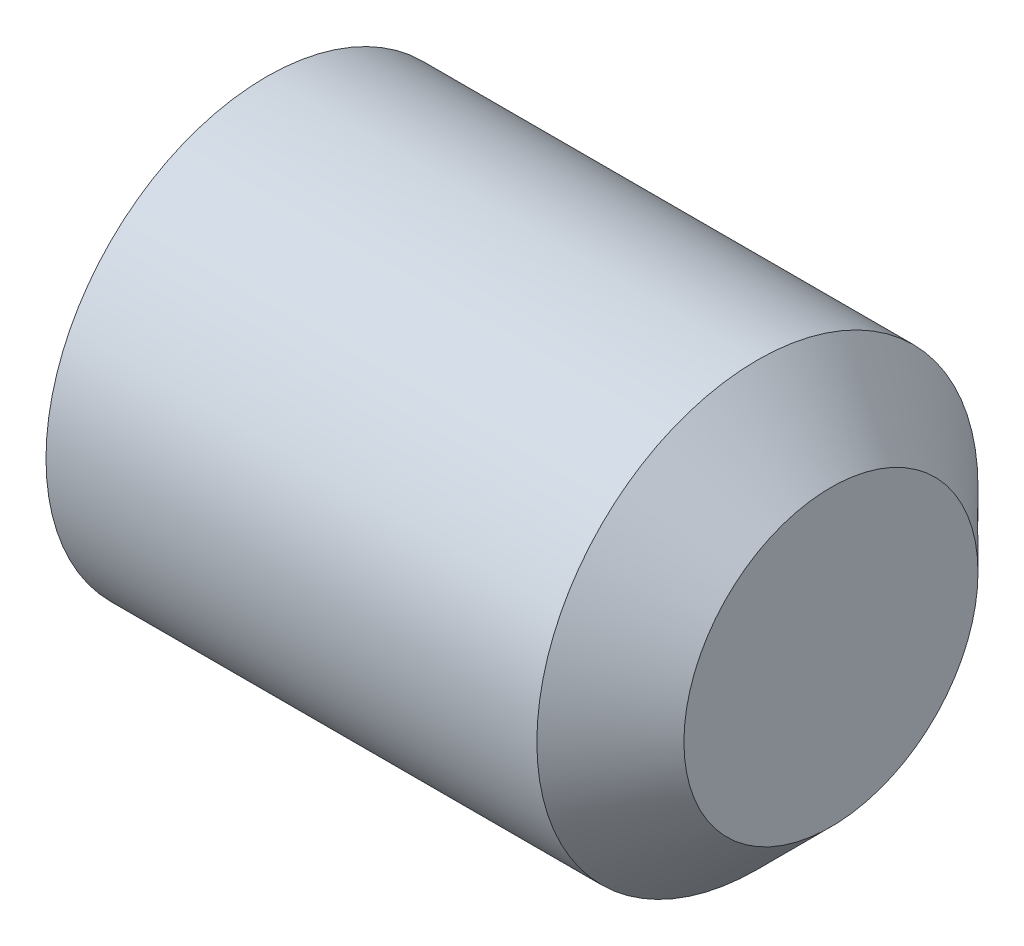
ISO-10303-21;
HEADER;
FILE_DESCRIPTION(('STEP AP214'),'2;1');
FILE_NAME('part.step','',(''),(''),'','','');
FILE_SCHEMA(('AUTOMOTIVE_DESIGN { 1 0 10303 214 1 1 1 1 }'));
ENDSEC;
DATA;
#1=APPLICATION_CONTEXT('core data for automotive mechanical design processes');
#2=APPLICATION_PROTOCOL_DEFINITION('international standard','automotive_design',2000,#1);
#3=PRODUCT_CONTEXT('',#1,'mechanical');
#4=PRODUCT('Part','Part','',(#3));
#5=PRODUCT_RELATED_PRODUCT_CATEGORY('part','',(#4));
#6=PRODUCT_DEFINITION_FORMATION('','',#4);
#7=PRODUCT_DEFINITION_CONTEXT('part definition',#1,'design');
#8=PRODUCT_DEFINITION('design','',#6,#7);
#9=PRODUCT_DEFINITION_SHAPE('','',#8);
#10=(LENGTH_UNIT() NAMED_UNIT(*) SI_UNIT(.MILLI.,.METRE.));
#11=(NAMED_UNIT(*) PLANE_ANGLE_UNIT() SI_UNIT($,.RADIAN.));
#12=(NAMED_UNIT(*) SI_UNIT($,.STERADIAN.) SOLID_ANGLE_UNIT());
#13=UNCERTAINTY_MEASURE_WITH_UNIT(LENGTH_MEASURE(1.E-05),#10,'distance_accuracy_value','');
#14=(GEOMETRIC_REPRESENTATION_CONTEXT(3) GLOBAL_UNCERTAINTY_ASSIGNED_CONTEXT((#13)) GLOBAL_UNIT_ASSIGNED_CONTEXT((#10,
#11,#12)) REPRESENTATION_CONTEXT('',''));
#15=CARTESIAN_POINT('',(0.,0.,0.));
#16=DIRECTION('',(0.,0.,1.));
#17=DIRECTION('',(1.,0.,0.));
#18=AXIS2_PLACEMENT_3D('',#15,#16,#17);
#19=CARTESIAN_POINT('',(0.,0.,0.));
#20=DIRECTION('',(-1.,0.,0.));
#21=DIRECTION('',(0.,0.,1.));
#22=AXIS2_PLACEMENT_3D('',#19,#20,#21);
#23=PLANE('',#22);
#24=CARTESIAN_POINT('',(0.,0.,0.));
#25=DIRECTION('',(-1.,0.,0.));
#26=DIRECTION('',(0.,0.,1.));
#27=AXIS2_PLACEMENT_3D('',#24,#25,#26);
#28=CIRCLE('',#27,1.2195);
#29=CARTESIAN_POINT('',(0.,0.,1.2195));
#30=VERTEX_POINT('',#29);
#31=EDGE_CURVE('E142',#30,#30,#28,.T.);
#32=ORIENTED_EDGE('',*,*,#31,.T.);
#33=EDGE_LOOP('',(#32));
#34=FACE_BOUND('',#33,.T.);
#35=DIRECTION('',(0.,0.,-1.));
#36=VECTOR('',#35,1.);
#37=CARTESIAN_POINT('',(0.,0.75,0.43301270189222));
#38=LINE('',#37,#36);
#39=CARTESIAN_POINT('',(0.,0.75,0.43301270189222));
#40=VERTEX_POINT('',#39);
#41=CARTESIAN_POINT('',(0.,0.75,-0.433012701892219));
#42=VERTEX_POINT('',#41);
#43=EDGE_CURVE('E133',#40,#42,#38,.T.);
#44=ORIENTED_EDGE('',*,*,#43,.F.);
#45=DIRECTION('',(0.,-0.866025403784438,0.5));
#46=VECTOR('',#45,1.);
#47=CARTESIAN_POINT('',(0.,0.75,0.43301270189222));
#48=LINE('',#47,#46);
#49=CARTESIAN_POINT('',(0.,0.,0.866025403784439));
#50=VERTEX_POINT('',#49);
#51=EDGE_CURVE('E55',#40,#50,#48,.T.);
#52=ORIENTED_EDGE('',*,*,#51,.T.);
#53=DIRECTION('',(0.,0.866025403784438,0.5));
#54=VECTOR('',#53,1.);
#55=CARTESIAN_POINT('',(0.,-0.750000000000001,0.43301270189222));
#56=LINE('',#55,#54);
#57=CARTESIAN_POINT('',(0.,-0.750000000000001,0.43301270189222));
#58=VERTEX_POINT('',#57);
#59=EDGE_CURVE('E124',#58,#50,#56,.T.);
#60=ORIENTED_EDGE('',*,*,#59,.F.);
#61=DIRECTION('',(0.,0.,-1.));
#62=VECTOR('',#61,1.);
#63=CARTESIAN_POINT('',(0.,-0.750000000000001,0.43301270189222));
#64=LINE('',#63,#62);
#65=CARTESIAN_POINT('',(0.,-0.750000000000001,-0.433012701892219));
#66=VERTEX_POINT('',#65);
#67=EDGE_CURVE('E127',#58,#66,#64,.T.);
#68=ORIENTED_EDGE('',*,*,#67,.T.);
#69=DIRECTION('',(0.,0.866025403784438,-0.500000000000001));
#70=VECTOR('',#69,1.);
#71=CARTESIAN_POINT('',(0.,-0.750000000000001,-0.433012701892219));
#72=LINE('',#71,#70);
#73=CARTESIAN_POINT('',(0.,0.,-0.866025403784439));
#74=VERTEX_POINT('',#73);
#75=EDGE_CURVE('E130',#66,#74,#72,.T.);
#76=ORIENTED_EDGE('',*,*,#75,.T.);
#77=DIRECTION('',(0.,-0.866025403784438,-0.500000000000001));
#78=VECTOR('',#77,1.);
#79=CARTESIAN_POINT('',(0.,0.75,-0.433012701892219));
#80=LINE('',#79,#78);
#81=EDGE_CURVE('E113',#42,#74,#80,.T.);
#82=ORIENTED_EDGE('',*,*,#81,.F.);
#83=EDGE_LOOP('',(#44,#52,#60,#68,#76,#82));
#84=FACE_BOUND('',#83,.T.);
#85=ADVANCED_FACE('F40',(#34,#84),#23,.T.);
#86=CARTESIAN_POINT('',(4.,1.,0.));
#87=DIRECTION('',(1.,0.,0.));
#88=DIRECTION('',(0.,0.,-1.));
#89=AXIS2_PLACEMENT_3D('',#86,#87,#88);
#90=PLANE('',#89);
#91=CARTESIAN_POINT('',(4.,0.,0.));
#92=DIRECTION('',(-1.,0.,0.));
#93=DIRECTION('',(0.,0.,1.));
#94=AXIS2_PLACEMENT_3D('',#91,#92,#93);
#95=CIRCLE('',#94,1.);
#96=CARTESIAN_POINT('',(4.,0.,1.));
#97=VERTEX_POINT('',#96);
#98=EDGE_CURVE('E11',#97,#97,#95,.T.);
#99=ORIENTED_EDGE('',*,*,#98,.F.);
#100=EDGE_LOOP('',(#99));
#101=FACE_BOUND('',#100,.T.);
#102=ADVANCED_FACE('F42',(#101),#90,.T.);
#103=CARTESIAN_POINT('',(3.5,0.,0.));
#104=DIRECTION('',(-1.,0.,0.));
#105=DIRECTION('',(0.,0.,1.));
#106=AXIS2_PLACEMENT_3D('',#103,#104,#105);
#107=CONICAL_SURFACE('',#106,1.5,0.785398163397447);
#108=ORIENTED_EDGE('',*,*,#98,.T.);
#109=EDGE_LOOP('',(#108));
#110=FACE_BOUND('',#109,.T.);
#111=CARTESIAN_POINT('',(3.5,0.,0.));
#112=DIRECTION('',(-1.,0.,0.));
#113=DIRECTION('',(0.,0.,1.));
#114=AXIS2_PLACEMENT_3D('',#111,#112,#113);
#115=CIRCLE('',#114,1.5);
#116=CARTESIAN_POINT('',(3.5,0.,1.5));
#117=VERTEX_POINT('',#116);
#118=EDGE_CURVE('E48',#117,#117,#115,.T.);
#119=ORIENTED_EDGE('',*,*,#118,.F.);
#120=EDGE_LOOP('',(#119));
#121=FACE_BOUND('',#120,.T.);
#122=ADVANCED_FACE('F153',(#110,#121),#107,.T.);
#123=CARTESIAN_POINT('',(-12.7,0.,0.));
#124=DIRECTION('',(-1.,0.,0.));
#125=DIRECTION('',(0.,0.,1.));
#126=AXIS2_PLACEMENT_3D('',#123,#124,#125);
#127=CYLINDRICAL_SURFACE('',#126,1.5);
#128=ORIENTED_EDGE('',*,*,#118,.T.);
#129=EDGE_LOOP('',(#128));
#130=FACE_BOUND('',#129,.T.);
#131=CARTESIAN_POINT('',(0.161946750507689,0.,0.));
#132=DIRECTION('',(-1.,0.,0.));
#133=DIRECTION('',(0.,0.,1.));
#134=AXIS2_PLACEMENT_3D('',#131,#132,#133);
#135=CIRCLE('',#134,1.5);
#136=CARTESIAN_POINT('',(0.161946750507689,0.,1.5));
#137=VERTEX_POINT('',#136);
#138=EDGE_CURVE('E145',#137,#137,#135,.T.);
#139=ORIENTED_EDGE('',*,*,#138,.F.);
#140=EDGE_LOOP('',(#139));
#141=FACE_BOUND('',#140,.T.);
#142=ADVANCED_FACE('F150',(#130,#141),#127,.T.);
#143=CARTESIAN_POINT('',(0.,0.,0.));
#144=DIRECTION('',(1.,0.,0.));
#145=DIRECTION('',(0.,0.,-1.));
#146=AXIS2_PLACEMENT_3D('',#143,#144,#145);
#147=CONICAL_SURFACE('',#146,1.2195,1.0471975511966);
#148=ORIENTED_EDGE('',*,*,#138,.T.);
#149=EDGE_LOOP('',(#148));
#150=FACE_BOUND('',#149,.T.);
#151=ORIENTED_EDGE('',*,*,#31,.F.);
#152=EDGE_LOOP('',(#151));
#153=FACE_BOUND('',#152,.T.);
#154=ADVANCED_FACE('F160',(#150,#153),#147,.T.);
#155=CARTESIAN_POINT('',(2.1,0.75,0.43301270189222));
#156=DIRECTION('',(0.,-0.5,-0.866025403784439));
#157=DIRECTION('',(0.,0.866025403784439,-0.5));
#158=AXIS2_PLACEMENT_3D('',#155,#156,#157);
#159=PLANE('',#158);
#160=ORIENTED_EDGE('',*,*,#51,.F.);
#161=DIRECTION('',(-1.,0.,0.));
#162=VECTOR('',#161,1.);
#163=CARTESIAN_POINT('',(2.1,0.75,0.43301270189222));
#164=LINE('',#163,#162);
#165=CARTESIAN_POINT('',(2.1,0.75,0.43301270189222));
#166=VERTEX_POINT('',#165);
#167=EDGE_CURVE('E60',#166,#40,#164,.T.);
#168=ORIENTED_EDGE('',*,*,#167,.F.);
#169=DIRECTION('',(0.,-0.866025403784438,0.5));
#170=VECTOR('',#169,1.);
#171=CARTESIAN_POINT('',(2.1,0.75,0.43301270189222));
#172=LINE('',#171,#170);
#173=CARTESIAN_POINT('',(2.1,0.,0.866025403784439));
#174=VERTEX_POINT('',#173);
#175=EDGE_CURVE('E87',#166,#174,#172,.T.);
#176=ORIENTED_EDGE('',*,*,#175,.T.);
#177=DIRECTION('',(-1.,0.,0.));
#178=VECTOR('',#177,1.);
#179=CARTESIAN_POINT('',(2.1,0.,0.866025403784439));
#180=LINE('',#179,#178);
#181=EDGE_CURVE('E140',#174,#50,#180,.T.);
#182=ORIENTED_EDGE('',*,*,#181,.T.);
#183=EDGE_LOOP('',(#160,#168,#176,#182));
#184=FACE_BOUND('',#183,.T.);
#185=ADVANCED_FACE('F171',(#184),#159,.T.);
#186=CARTESIAN_POINT('',(2.1,-0.750000000000001,0.43301270189222));
#187=DIRECTION('',(0.,-0.5,0.866025403784439));
#188=DIRECTION('',(0.,-0.866025403784439,-0.5));
#189=AXIS2_PLACEMENT_3D('',#186,#187,#188);
#190=PLANE('',#189);
#191=ORIENTED_EDGE('',*,*,#59,.T.);
#192=ORIENTED_EDGE('',*,*,#181,.F.);
#193=DIRECTION('',(0.,0.866025403784438,0.5));
#194=VECTOR('',#193,1.);
#195=CARTESIAN_POINT('',(2.1,-0.750000000000001,0.43301270189222));
#196=LINE('',#195,#194);
#197=CARTESIAN_POINT('',(2.1,-0.750000000000001,0.43301270189222));
#198=VERTEX_POINT('',#197);
#199=EDGE_CURVE('E321',#198,#174,#196,.T.);
#200=ORIENTED_EDGE('',*,*,#199,.F.);
#201=DIRECTION('',(-1.,0.,0.));
#202=VECTOR('',#201,1.);
#203=CARTESIAN_POINT('',(2.1,-0.750000000000001,0.43301270189222));
#204=LINE('',#203,#202);
#205=EDGE_CURVE('E138',#198,#58,#204,.T.);
#206=ORIENTED_EDGE('',*,*,#205,.T.);
#207=EDGE_LOOP('',(#191,#192,#200,#206));
#208=FACE_BOUND('',#207,.T.);
#209=ADVANCED_FACE('F178',(#208),#190,.F.);
#210=CARTESIAN_POINT('',(2.1,-0.750000000000001,0.43301270189222));
#211=DIRECTION('',(0.,1.,0.));
#212=DIRECTION('',(0.,0.,1.));
#213=AXIS2_PLACEMENT_3D('',#210,#211,#212);
#214=PLANE('',#213);
#215=ORIENTED_EDGE('',*,*,#67,.F.);
#216=ORIENTED_EDGE('',*,*,#205,.F.);
#217=DIRECTION('',(0.,0.,-1.));
#218=VECTOR('',#217,1.);
#219=CARTESIAN_POINT('',(2.1,-0.750000000000001,0.43301270189222));
#220=LINE('',#219,#218);
#221=CARTESIAN_POINT('',(2.1,-0.750000000000001,-0.433012701892219));
#222=VERTEX_POINT('',#221);
#223=EDGE_CURVE('E108',#198,#222,#220,.T.);
#224=ORIENTED_EDGE('',*,*,#223,.T.);
#225=DIRECTION('',(-1.,0.,0.));
#226=VECTOR('',#225,1.);
#227=CARTESIAN_POINT('',(2.1,-0.750000000000001,-0.433012701892219));
#228=LINE('',#227,#226);
#229=EDGE_CURVE('E103',#222,#66,#228,.T.);
#230=ORIENTED_EDGE('',*,*,#229,.T.);
#231=EDGE_LOOP('',(#215,#216,#224,#230));
#232=FACE_BOUND('',#231,.T.);
#233=ADVANCED_FACE('F185',(#232),#214,.T.);
#234=CARTESIAN_POINT('',(2.1,-0.750000000000001,-0.433012701892219));
#235=DIRECTION('',(0.,0.500000000000001,0.866025403784438));
#236=DIRECTION('',(0.,-0.866025403784438,0.500000000000001));
#237=AXIS2_PLACEMENT_3D('',#234,#235,#236);
#238=PLANE('',#237);
#239=ORIENTED_EDGE('',*,*,#75,.F.);
#240=ORIENTED_EDGE('',*,*,#229,.F.);
#241=DIRECTION('',(0.,0.866025403784438,-0.500000000000001));
#242=VECTOR('',#241,1.);
#243=CARTESIAN_POINT('',(2.1,-0.750000000000001,-0.433012701892219));
#244=LINE('',#243,#242);
#245=CARTESIAN_POINT('',(2.1,0.,-0.866025403784439));
#246=VERTEX_POINT('',#245);
#247=EDGE_CURVE('E98',#222,#246,#244,.T.);
#248=ORIENTED_EDGE('',*,*,#247,.T.);
#249=DIRECTION('',(-1.,0.,0.));
#250=VECTOR('',#249,1.);
#251=CARTESIAN_POINT('',(2.1,0.,-0.866025403784439));
#252=LINE('',#251,#250);
#253=EDGE_CURVE('E102',#246,#74,#252,.T.);
#254=ORIENTED_EDGE('',*,*,#253,.T.);
#255=EDGE_LOOP('',(#239,#240,#248,#254));
#256=FACE_BOUND('',#255,.T.);
#257=ADVANCED_FACE('F101',(#256),#238,.T.);
#258=CARTESIAN_POINT('',(2.1,0.75,-0.433012701892219));
#259=DIRECTION('',(0.,0.500000000000001,-0.866025403784438));
#260=DIRECTION('',(0.,0.866025403784438,0.500000000000001));
#261=AXIS2_PLACEMENT_3D('',#258,#259,#260);
#262=PLANE('',#261);
#263=ORIENTED_EDGE('',*,*,#81,.T.);
#264=ORIENTED_EDGE('',*,*,#253,.F.);
#265=DIRECTION('',(0.,-0.866025403784438,-0.500000000000001));
#266=VECTOR('',#265,1.);
#267=CARTESIAN_POINT('',(2.1,0.75,-0.433012701892219));
#268=LINE('',#267,#266);
#269=CARTESIAN_POINT('',(2.1,0.75,-0.433012701892219));
#270=VERTEX_POINT('',#269);
#271=EDGE_CURVE('E107',#270,#246,#268,.T.);
#272=ORIENTED_EDGE('',*,*,#271,.F.);
#273=DIRECTION('',(-1.,0.,0.));
#274=VECTOR('',#273,1.);
#275=CARTESIAN_POINT('',(2.1,0.75,-0.433012701892219));
#276=LINE('',#275,#274);
#277=EDGE_CURVE('E83',#270,#42,#276,.T.);
#278=ORIENTED_EDGE('',*,*,#277,.T.);
#279=EDGE_LOOP('',(#263,#264,#272,#278));
#280=FACE_BOUND('',#279,.T.);
#281=ADVANCED_FACE('F110',(#280),#262,.F.);
#282=CARTESIAN_POINT('',(2.1,0.75,0.43301270189222));
#283=DIRECTION('',(0.,1.,0.));
#284=DIRECTION('',(0.,0.,1.));
#285=AXIS2_PLACEMENT_3D('',#282,#283,#284);
#286=PLANE('',#285);
#287=ORIENTED_EDGE('',*,*,#43,.T.);
#288=ORIENTED_EDGE('',*,*,#277,.F.);
#289=DIRECTION('',(0.,0.,-1.));
#290=VECTOR('',#289,1.);
#291=CARTESIAN_POINT('',(2.1,0.75,0.43301270189222));
#292=LINE('',#291,#290);
#293=EDGE_CURVE('E118',#166,#270,#292,.T.);
#294=ORIENTED_EDGE('',*,*,#293,.F.);
#295=ORIENTED_EDGE('',*,*,#167,.T.);
#296=EDGE_LOOP('',(#287,#288,#294,#295));
#297=FACE_BOUND('',#296,.T.);
#298=ADVANCED_FACE('F197',(#297),#286,.F.);
#299=CARTESIAN_POINT('',(2.1,1.5,0.));
#300=DIRECTION('',(1.,0.,0.));
#301=DIRECTION('',(0.,0.,-1.));
#302=AXIS2_PLACEMENT_3D('',#299,#300,#301);
#303=PLANE('',#302);
#304=ORIENTED_EDGE('',*,*,#175,.F.);
#305=ORIENTED_EDGE('',*,*,#293,.T.);
#306=ORIENTED_EDGE('',*,*,#271,.T.);
#307=ORIENTED_EDGE('',*,*,#247,.F.);
#308=ORIENTED_EDGE('',*,*,#223,.F.);
#309=ORIENTED_EDGE('',*,*,#199,.T.);
#310=EDGE_LOOP('',(#304,#305,#306,#307,#308,#309));
#311=FACE_BOUND('',#310,.T.);
#312=ADVANCED_FACE('F116',(#311),#303,.F.);
#313=CLOSED_SHELL('',(#85,#102,#122,#142,#154,#185,#209,#233,#257,#281,#298,#312));
#314=MANIFOLD_SOLID_BREP('B2',#313);
#315=ADVANCED_BREP_SHAPE_REPRESENTATION('',(#18,#314),#14);
#316=SHAPE_DEFINITION_REPRESENTATION(#9,#315);
ENDSEC;
END-ISO-10303-21;
